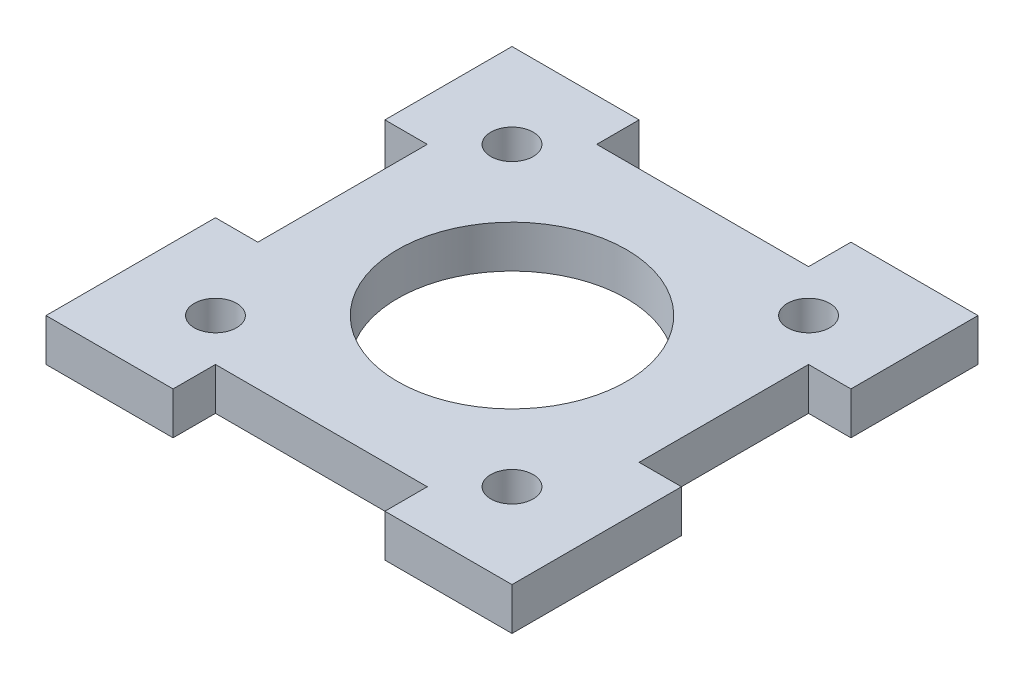
ISO-10303-21;
HEADER;
FILE_DESCRIPTION(('STEP AP214'),'2;1');
FILE_NAME('part.step','',(''),(''),'','','');
FILE_SCHEMA(('AUTOMOTIVE_DESIGN { 1 0 10303 214 1 1 1 1 }'));
ENDSEC;
DATA;
#1=APPLICATION_CONTEXT('core data for automotive mechanical design processes');
#2=APPLICATION_PROTOCOL_DEFINITION('international standard','automotive_design',2000,#1);
#3=PRODUCT_CONTEXT('',#1,'mechanical');
#4=PRODUCT('Part','Part','',(#3));
#5=PRODUCT_RELATED_PRODUCT_CATEGORY('part','',(#4));
#6=PRODUCT_DEFINITION_FORMATION('','',#4);
#7=PRODUCT_DEFINITION_CONTEXT('part definition',#1,'design');
#8=PRODUCT_DEFINITION('design','',#6,#7);
#9=PRODUCT_DEFINITION_SHAPE('','',#8);
#10=(LENGTH_UNIT() NAMED_UNIT(*) SI_UNIT(.MILLI.,.METRE.));
#11=(NAMED_UNIT(*) PLANE_ANGLE_UNIT() SI_UNIT($,.RADIAN.));
#12=(NAMED_UNIT(*) SI_UNIT($,.STERADIAN.) SOLID_ANGLE_UNIT());
#13=UNCERTAINTY_MEASURE_WITH_UNIT(LENGTH_MEASURE(1.E-05),#10,'distance_accuracy_value','');
#14=(GEOMETRIC_REPRESENTATION_CONTEXT(3) GLOBAL_UNCERTAINTY_ASSIGNED_CONTEXT((#13)) GLOBAL_UNIT_ASSIGNED_CONTEXT((#10,
#11,#12)) REPRESENTATION_CONTEXT('',''));
#15=CARTESIAN_POINT('',(0.,0.,0.));
#16=DIRECTION('',(0.,0.,1.));
#17=DIRECTION('',(1.,0.,0.));
#18=AXIS2_PLACEMENT_3D('',#15,#16,#17);
#19=CARTESIAN_POINT('',(0.,5.,0.));
#20=DIRECTION('',(0.,-1.,0.));
#21=DIRECTION('',(0.,0.,-1.));
#22=AXIS2_PLACEMENT_3D('',#19,#20,#21);
#23=PLANE('',#22);
#24=DIRECTION('',(1.,0.,0.));
#25=VECTOR('',#24,1.);
#26=CARTESIAN_POINT('',(12.5,5.,27.5));
#27=LINE('',#26,#25);
#28=CARTESIAN_POINT('',(12.5,5.,27.5));
#29=VERTEX_POINT('',#28);
#30=CARTESIAN_POINT('',(27.5,5.,27.5));
#31=VERTEX_POINT('',#30);
#32=EDGE_CURVE('E241',#29,#31,#27,.T.);
#33=ORIENTED_EDGE('',*,*,#32,.T.);
#34=DIRECTION('',(0.,0.,-1.));
#35=VECTOR('',#34,1.);
#36=CARTESIAN_POINT('',(27.5,5.,7.5));
#37=LINE('',#36,#35);
#38=CARTESIAN_POINT('',(27.5,5.,7.5));
#39=VERTEX_POINT('',#38);
#40=EDGE_CURVE('E129',#31,#39,#37,.T.);
#41=ORIENTED_EDGE('',*,*,#40,.T.);
#42=DIRECTION('',(-1.,0.,0.));
#43=VECTOR('',#42,1.);
#44=CARTESIAN_POINT('',(27.5,5.,7.5));
#45=LINE('',#44,#43);
#46=CARTESIAN_POINT('',(22.5,5.,7.5));
#47=VERTEX_POINT('',#46);
#48=EDGE_CURVE('E292',#39,#47,#45,.T.);
#49=ORIENTED_EDGE('',*,*,#48,.T.);
#50=DIRECTION('',(0.,0.,-1.));
#51=VECTOR('',#50,1.);
#52=CARTESIAN_POINT('',(22.5,5.,7.5));
#53=LINE('',#52,#51);
#54=CARTESIAN_POINT('',(22.5,5.,-12.5));
#55=VERTEX_POINT('',#54);
#56=EDGE_CURVE('E311',#47,#55,#53,.T.);
#57=ORIENTED_EDGE('',*,*,#56,.T.);
#58=DIRECTION('',(1.,0.,0.));
#59=VECTOR('',#58,1.);
#60=CARTESIAN_POINT('',(27.5,5.,-12.5));
#61=LINE('',#60,#59);
#62=CARTESIAN_POINT('',(27.5,5.,-12.5));
#63=VERTEX_POINT('',#62);
#64=EDGE_CURVE('E308',#55,#63,#61,.T.);
#65=ORIENTED_EDGE('',*,*,#64,.T.);
#66=DIRECTION('',(0.,0.,-1.));
#67=VECTOR('',#66,1.);
#68=CARTESIAN_POINT('',(27.5,5.,-27.5));
#69=LINE('',#68,#67);
#70=CARTESIAN_POINT('',(27.5,5.,-27.5));
#71=VERTEX_POINT('',#70);
#72=EDGE_CURVE('E310',#63,#71,#69,.T.);
#73=ORIENTED_EDGE('',*,*,#72,.T.);
#74=DIRECTION('',(-1.,0.,0.));
#75=VECTOR('',#74,1.);
#76=CARTESIAN_POINT('',(12.5,5.,-27.5));
#77=LINE('',#76,#75);
#78=CARTESIAN_POINT('',(12.5,5.,-27.5));
#79=VERTEX_POINT('',#78);
#80=EDGE_CURVE('E313',#71,#79,#77,.T.);
#81=ORIENTED_EDGE('',*,*,#80,.T.);
#82=DIRECTION('',(0.,0.,1.));
#83=VECTOR('',#82,1.);
#84=CARTESIAN_POINT('',(12.5,5.,-27.5));
#85=LINE('',#84,#83);
#86=CARTESIAN_POINT('',(12.5,5.,-22.5));
#87=VERTEX_POINT('',#86);
#88=EDGE_CURVE('E319',#79,#87,#85,.T.);
#89=ORIENTED_EDGE('',*,*,#88,.T.);
#90=DIRECTION('',(-1.,0.,0.));
#91=VECTOR('',#90,1.);
#92=CARTESIAN_POINT('',(12.5,5.,-22.5));
#93=LINE('',#92,#91);
#94=CARTESIAN_POINT('',(-12.5,5.,-22.5));
#95=VERTEX_POINT('',#94);
#96=EDGE_CURVE('E321',#87,#95,#93,.T.);
#97=ORIENTED_EDGE('',*,*,#96,.T.);
#98=DIRECTION('',(0.,0.,-1.));
#99=VECTOR('',#98,1.);
#100=CARTESIAN_POINT('',(-12.5,5.,-27.5));
#101=LINE('',#100,#99);
#102=CARTESIAN_POINT('',(-12.5,5.,-27.5));
#103=VERTEX_POINT('',#102);
#104=EDGE_CURVE('E323',#95,#103,#101,.T.);
#105=ORIENTED_EDGE('',*,*,#104,.T.);
#106=DIRECTION('',(-1.,0.,0.));
#107=VECTOR('',#106,1.);
#108=CARTESIAN_POINT('',(-27.5,5.,-27.5));
#109=LINE('',#108,#107);
#110=CARTESIAN_POINT('',(-27.5,5.,-27.5));
#111=VERTEX_POINT('',#110);
#112=EDGE_CURVE('E325',#103,#111,#109,.T.);
#113=ORIENTED_EDGE('',*,*,#112,.T.);
#114=DIRECTION('',(0.,0.,1.));
#115=VECTOR('',#114,1.);
#116=CARTESIAN_POINT('',(-27.5,5.,-27.5));
#117=LINE('',#116,#115);
#118=CARTESIAN_POINT('',(-27.5,5.,-12.5));
#119=VERTEX_POINT('',#118);
#120=EDGE_CURVE('E327',#111,#119,#117,.T.);
#121=ORIENTED_EDGE('',*,*,#120,.T.);
#122=DIRECTION('',(1.,0.,0.));
#123=VECTOR('',#122,1.);
#124=CARTESIAN_POINT('',(-27.5,5.,-12.5));
#125=LINE('',#124,#123);
#126=CARTESIAN_POINT('',(-22.5,5.,-12.5));
#127=VERTEX_POINT('',#126);
#128=EDGE_CURVE('E329',#119,#127,#125,.T.);
#129=ORIENTED_EDGE('',*,*,#128,.T.);
#130=DIRECTION('',(0.,0.,1.));
#131=VECTOR('',#130,1.);
#132=CARTESIAN_POINT('',(-22.5,5.,7.50000000000001));
#133=LINE('',#132,#131);
#134=CARTESIAN_POINT('',(-22.5,5.,7.50000000000001));
#135=VERTEX_POINT('',#134);
#136=EDGE_CURVE('E331',#127,#135,#133,.T.);
#137=ORIENTED_EDGE('',*,*,#136,.T.);
#138=DIRECTION('',(-1.,0.,0.));
#139=VECTOR('',#138,1.);
#140=CARTESIAN_POINT('',(-27.5,5.,7.50000000000001));
#141=LINE('',#140,#139);
#142=CARTESIAN_POINT('',(-27.5,5.,7.50000000000001));
#143=VERTEX_POINT('',#142);
#144=EDGE_CURVE('E333',#135,#143,#141,.T.);
#145=ORIENTED_EDGE('',*,*,#144,.T.);
#146=DIRECTION('',(0.,0.,1.));
#147=VECTOR('',#146,1.);
#148=CARTESIAN_POINT('',(-27.5,5.,7.50000000000001));
#149=LINE('',#148,#147);
#150=CARTESIAN_POINT('',(-27.5,5.,27.5));
#151=VERTEX_POINT('',#150);
#152=EDGE_CURVE('E335',#143,#151,#149,.T.);
#153=ORIENTED_EDGE('',*,*,#152,.T.);
#154=DIRECTION('',(1.,0.,0.));
#155=VECTOR('',#154,1.);
#156=CARTESIAN_POINT('',(-27.5,5.,27.5));
#157=LINE('',#156,#155);
#158=CARTESIAN_POINT('',(-12.5,5.,27.5));
#159=VERTEX_POINT('',#158);
#160=EDGE_CURVE('E184',#151,#159,#157,.T.);
#161=ORIENTED_EDGE('',*,*,#160,.T.);
#162=DIRECTION('',(0.,0.,-1.));
#163=VECTOR('',#162,1.);
#164=CARTESIAN_POINT('',(-12.5,5.,27.5));
#165=LINE('',#164,#163);
#166=CARTESIAN_POINT('',(-12.5,5.,22.5));
#167=VERTEX_POINT('',#166);
#168=EDGE_CURVE('E178',#159,#167,#165,.T.);
#169=ORIENTED_EDGE('',*,*,#168,.T.);
#170=DIRECTION('',(1.,0.,0.));
#171=VECTOR('',#170,1.);
#172=CARTESIAN_POINT('',(12.5,5.,22.5));
#173=LINE('',#172,#171);
#174=CARTESIAN_POINT('',(12.5,5.,22.5));
#175=VERTEX_POINT('',#174);
#176=EDGE_CURVE('E182',#167,#175,#173,.T.);
#177=ORIENTED_EDGE('',*,*,#176,.T.);
#178=DIRECTION('',(0.,0.,1.));
#179=VECTOR('',#178,1.);
#180=CARTESIAN_POINT('',(12.5,5.,27.5));
#181=LINE('',#180,#179);
#182=EDGE_CURVE('E50',#175,#29,#181,.T.);
#183=ORIENTED_EDGE('',*,*,#182,.T.);
#184=EDGE_LOOP('',(#33,#41,#49,#57,#65,#73,#81,#89,#97,#105,#113,#121,#129,#137,#145,#153,#161,
#169,#177,#183));
#185=FACE_BOUND('',#184,.T.);
#186=CARTESIAN_POINT('',(17.5,5.,-17.5));
#187=DIRECTION('',(0.,1.,0.));
#188=DIRECTION('',(0.,0.,1.));
#189=AXIS2_PLACEMENT_3D('',#186,#187,#188);
#190=CIRCLE('',#189,2.5);
#191=CARTESIAN_POINT('',(17.5,5.,-15.));
#192=VERTEX_POINT('',#191);
#193=EDGE_CURVE('E206',#192,#192,#190,.T.);
#194=ORIENTED_EDGE('',*,*,#193,.F.);
#195=EDGE_LOOP('',(#194));
#196=FACE_BOUND('',#195,.T.);
#197=CARTESIAN_POINT('',(-17.5,5.,-17.5));
#198=DIRECTION('',(0.,1.,0.));
#199=DIRECTION('',(0.,0.,-1.));
#200=AXIS2_PLACEMENT_3D('',#197,#198,#199);
#201=CIRCLE('',#200,2.5);
#202=CARTESIAN_POINT('',(-17.5,5.,-20.));
#203=VERTEX_POINT('',#202);
#204=EDGE_CURVE('E409',#203,#203,#201,.T.);
#205=ORIENTED_EDGE('',*,*,#204,.F.);
#206=EDGE_LOOP('',(#205));
#207=FACE_BOUND('',#206,.T.);
#208=CARTESIAN_POINT('',(-17.5,5.,17.5));
#209=DIRECTION('',(0.,1.,0.));
#210=DIRECTION('',(0.,0.,1.));
#211=AXIS2_PLACEMENT_3D('',#208,#209,#210);
#212=CIRCLE('',#211,2.5);
#213=CARTESIAN_POINT('',(-17.5,5.,20.));
#214=VERTEX_POINT('',#213);
#215=EDGE_CURVE('E403',#214,#214,#212,.T.);
#216=ORIENTED_EDGE('',*,*,#215,.F.);
#217=EDGE_LOOP('',(#216));
#218=FACE_BOUND('',#217,.T.);
#219=CARTESIAN_POINT('',(17.5,5.,17.5));
#220=DIRECTION('',(0.,1.,0.));
#221=DIRECTION('',(0.,0.,-1.));
#222=AXIS2_PLACEMENT_3D('',#219,#220,#221);
#223=CIRCLE('',#222,2.5);
#224=CARTESIAN_POINT('',(17.5,5.,15.));
#225=VERTEX_POINT('',#224);
#226=EDGE_CURVE('E397',#225,#225,#223,.T.);
#227=ORIENTED_EDGE('',*,*,#226,.F.);
#228=EDGE_LOOP('',(#227));
#229=FACE_BOUND('',#228,.T.);
#230=CARTESIAN_POINT('',(0.,5.,0.));
#231=DIRECTION('',(0.,1.,0.));
#232=DIRECTION('',(0.,0.,1.));
#233=AXIS2_PLACEMENT_3D('',#230,#231,#232);
#234=CIRCLE('',#233,13.5);
#235=CARTESIAN_POINT('',(0.,5.,13.5));
#236=VERTEX_POINT('',#235);
#237=EDGE_CURVE('E388',#236,#236,#234,.T.);
#238=ORIENTED_EDGE('',*,*,#237,.F.);
#239=EDGE_LOOP('',(#238));
#240=FACE_BOUND('',#239,.T.);
#241=ADVANCED_FACE('F33',(#185,#196,#207,#218,#229,#240),#23,.F.);
#242=CARTESIAN_POINT('',(0.,0.,0.));
#243=DIRECTION('',(0.,-1.,0.));
#244=DIRECTION('',(0.,0.,-1.));
#245=AXIS2_PLACEMENT_3D('',#242,#243,#244);
#246=PLANE('',#245);
#247=CARTESIAN_POINT('',(17.5,0.,17.5));
#248=DIRECTION('',(0.,1.,0.));
#249=DIRECTION('',(0.,0.,-1.));
#250=AXIS2_PLACEMENT_3D('',#247,#248,#249);
#251=CIRCLE('',#250,2.5);
#252=CARTESIAN_POINT('',(17.5,0.,15.));
#253=VERTEX_POINT('',#252);
#254=EDGE_CURVE('E394',#253,#253,#251,.T.);
#255=ORIENTED_EDGE('',*,*,#254,.T.);
#256=EDGE_LOOP('',(#255));
#257=FACE_BOUND('',#256,.T.);
#258=CARTESIAN_POINT('',(-17.5,0.,-17.5));
#259=DIRECTION('',(0.,1.,0.));
#260=DIRECTION('',(0.,0.,-1.));
#261=AXIS2_PLACEMENT_3D('',#258,#259,#260);
#262=CIRCLE('',#261,2.5);
#263=CARTESIAN_POINT('',(-17.5,0.,-20.));
#264=VERTEX_POINT('',#263);
#265=EDGE_CURVE('E406',#264,#264,#262,.T.);
#266=ORIENTED_EDGE('',*,*,#265,.T.);
#267=EDGE_LOOP('',(#266));
#268=FACE_BOUND('',#267,.T.);
#269=DIRECTION('',(1.,0.,0.));
#270=VECTOR('',#269,1.);
#271=CARTESIAN_POINT('',(12.5,0.,27.5));
#272=LINE('',#271,#270);
#273=CARTESIAN_POINT('',(12.5,0.,27.5));
#274=VERTEX_POINT('',#273);
#275=CARTESIAN_POINT('',(27.5,0.,27.5));
#276=VERTEX_POINT('',#275);
#277=EDGE_CURVE('E202',#274,#276,#272,.T.);
#278=ORIENTED_EDGE('',*,*,#277,.F.);
#279=DIRECTION('',(0.,0.,1.));
#280=VECTOR('',#279,1.);
#281=CARTESIAN_POINT('',(12.5,0.,27.5));
#282=LINE('',#281,#280);
#283=CARTESIAN_POINT('',(12.5,0.,22.5));
#284=VERTEX_POINT('',#283);
#285=EDGE_CURVE('E121',#284,#274,#282,.T.);
#286=ORIENTED_EDGE('',*,*,#285,.F.);
#287=DIRECTION('',(1.,0.,0.));
#288=VECTOR('',#287,1.);
#289=CARTESIAN_POINT('',(12.5,0.,22.5));
#290=LINE('',#289,#288);
#291=CARTESIAN_POINT('',(-12.5,0.,22.5));
#292=VERTEX_POINT('',#291);
#293=EDGE_CURVE('E115',#292,#284,#290,.T.);
#294=ORIENTED_EDGE('',*,*,#293,.F.);
#295=DIRECTION('',(0.,0.,-1.));
#296=VECTOR('',#295,1.);
#297=CARTESIAN_POINT('',(-12.5,0.,27.5));
#298=LINE('',#297,#296);
#299=CARTESIAN_POINT('',(-12.5,0.,27.5));
#300=VERTEX_POINT('',#299);
#301=EDGE_CURVE('E192',#300,#292,#298,.T.);
#302=ORIENTED_EDGE('',*,*,#301,.F.);
#303=DIRECTION('',(1.,0.,0.));
#304=VECTOR('',#303,1.);
#305=CARTESIAN_POINT('',(-27.5,0.,27.5));
#306=LINE('',#305,#304);
#307=CARTESIAN_POINT('',(-27.5,0.,27.5));
#308=VERTEX_POINT('',#307);
#309=EDGE_CURVE('E236',#308,#300,#306,.T.);
#310=ORIENTED_EDGE('',*,*,#309,.F.);
#311=DIRECTION('',(0.,0.,1.));
#312=VECTOR('',#311,1.);
#313=CARTESIAN_POINT('',(-27.5,0.,7.50000000000001));
#314=LINE('',#313,#312);
#315=CARTESIAN_POINT('',(-27.5,0.,7.50000000000001));
#316=VERTEX_POINT('',#315);
#317=EDGE_CURVE('E234',#316,#308,#314,.T.);
#318=ORIENTED_EDGE('',*,*,#317,.F.);
#319=DIRECTION('',(-1.,0.,0.));
#320=VECTOR('',#319,1.);
#321=CARTESIAN_POINT('',(-27.5,0.,7.50000000000001));
#322=LINE('',#321,#320);
#323=CARTESIAN_POINT('',(-22.5,0.,7.50000000000001));
#324=VERTEX_POINT('',#323);
#325=EDGE_CURVE('E232',#324,#316,#322,.T.);
#326=ORIENTED_EDGE('',*,*,#325,.F.);
#327=DIRECTION('',(0.,0.,1.));
#328=VECTOR('',#327,1.);
#329=CARTESIAN_POINT('',(-22.5,0.,7.50000000000001));
#330=LINE('',#329,#328);
#331=CARTESIAN_POINT('',(-22.5,0.,-12.5));
#332=VERTEX_POINT('',#331);
#333=EDGE_CURVE('E230',#332,#324,#330,.T.);
#334=ORIENTED_EDGE('',*,*,#333,.F.);
#335=DIRECTION('',(1.,0.,0.));
#336=VECTOR('',#335,1.);
#337=CARTESIAN_POINT('',(-27.5,0.,-12.5));
#338=LINE('',#337,#336);
#339=CARTESIAN_POINT('',(-27.5,0.,-12.5));
#340=VERTEX_POINT('',#339);
#341=EDGE_CURVE('E228',#340,#332,#338,.T.);
#342=ORIENTED_EDGE('',*,*,#341,.F.);
#343=DIRECTION('',(0.,0.,1.));
#344=VECTOR('',#343,1.);
#345=CARTESIAN_POINT('',(-27.5,0.,-27.5));
#346=LINE('',#345,#344);
#347=CARTESIAN_POINT('',(-27.5,0.,-27.5));
#348=VERTEX_POINT('',#347);
#349=EDGE_CURVE('E226',#348,#340,#346,.T.);
#350=ORIENTED_EDGE('',*,*,#349,.F.);
#351=DIRECTION('',(-1.,0.,0.));
#352=VECTOR('',#351,1.);
#353=CARTESIAN_POINT('',(-27.5,0.,-27.5));
#354=LINE('',#353,#352);
#355=CARTESIAN_POINT('',(-12.5,0.,-27.5));
#356=VERTEX_POINT('',#355);
#357=EDGE_CURVE('E224',#356,#348,#354,.T.);
#358=ORIENTED_EDGE('',*,*,#357,.F.);
#359=DIRECTION('',(0.,0.,-1.));
#360=VECTOR('',#359,1.);
#361=CARTESIAN_POINT('',(-12.5,0.,-27.5));
#362=LINE('',#361,#360);
#363=CARTESIAN_POINT('',(-12.5,0.,-22.5));
#364=VERTEX_POINT('',#363);
#365=EDGE_CURVE('E222',#364,#356,#362,.T.);
#366=ORIENTED_EDGE('',*,*,#365,.F.);
#367=DIRECTION('',(-1.,0.,0.));
#368=VECTOR('',#367,1.);
#369=CARTESIAN_POINT('',(12.5,0.,-22.5));
#370=LINE('',#369,#368);
#371=CARTESIAN_POINT('',(12.5,0.,-22.5));
#372=VERTEX_POINT('',#371);
#373=EDGE_CURVE('E220',#372,#364,#370,.T.);
#374=ORIENTED_EDGE('',*,*,#373,.F.);
#375=DIRECTION('',(0.,0.,1.));
#376=VECTOR('',#375,1.);
#377=CARTESIAN_POINT('',(12.5,0.,-27.5));
#378=LINE('',#377,#376);
#379=CARTESIAN_POINT('',(12.5,0.,-27.5));
#380=VERTEX_POINT('',#379);
#381=EDGE_CURVE('E218',#380,#372,#378,.T.);
#382=ORIENTED_EDGE('',*,*,#381,.F.);
#383=DIRECTION('',(-1.,0.,0.));
#384=VECTOR('',#383,1.);
#385=CARTESIAN_POINT('',(12.5,0.,-27.5));
#386=LINE('',#385,#384);
#387=CARTESIAN_POINT('',(27.5,0.,-27.5));
#388=VERTEX_POINT('',#387);
#389=EDGE_CURVE('E216',#388,#380,#386,.T.);
#390=ORIENTED_EDGE('',*,*,#389,.F.);
#391=DIRECTION('',(0.,0.,-1.));
#392=VECTOR('',#391,1.);
#393=CARTESIAN_POINT('',(27.5,0.,-27.5));
#394=LINE('',#393,#392);
#395=CARTESIAN_POINT('',(27.5,0.,-12.5));
#396=VERTEX_POINT('',#395);
#397=EDGE_CURVE('E214',#396,#388,#394,.T.);
#398=ORIENTED_EDGE('',*,*,#397,.F.);
#399=DIRECTION('',(1.,0.,0.));
#400=VECTOR('',#399,1.);
#401=CARTESIAN_POINT('',(27.5,0.,-12.5));
#402=LINE('',#401,#400);
#403=CARTESIAN_POINT('',(22.5,0.,-12.5));
#404=VERTEX_POINT('',#403);
#405=EDGE_CURVE('E212',#404,#396,#402,.T.);
#406=ORIENTED_EDGE('',*,*,#405,.F.);
#407=DIRECTION('',(0.,0.,-1.));
#408=VECTOR('',#407,1.);
#409=CARTESIAN_POINT('',(22.5,0.,7.5));
#410=LINE('',#409,#408);
#411=CARTESIAN_POINT('',(22.5,0.,7.5));
#412=VERTEX_POINT('',#411);
#413=EDGE_CURVE('E210',#412,#404,#410,.T.);
#414=ORIENTED_EDGE('',*,*,#413,.F.);
#415=DIRECTION('',(-1.,0.,0.));
#416=VECTOR('',#415,1.);
#417=CARTESIAN_POINT('',(27.5,0.,7.5));
#418=LINE('',#417,#416);
#419=CARTESIAN_POINT('',(27.5,0.,7.5));
#420=VERTEX_POINT('',#419);
#421=EDGE_CURVE('E208',#420,#412,#418,.T.);
#422=ORIENTED_EDGE('',*,*,#421,.F.);
#423=DIRECTION('',(0.,0.,-1.));
#424=VECTOR('',#423,1.);
#425=CARTESIAN_POINT('',(27.5,0.,7.5));
#426=LINE('',#425,#424);
#427=EDGE_CURVE('E205',#276,#420,#426,.T.);
#428=ORIENTED_EDGE('',*,*,#427,.F.);
#429=EDGE_LOOP('',(#278,#286,#294,#302,#310,#318,#326,#334,#342,#350,#358,#366,#374,#382,#390,
#398,#406,#414,#422,#428));
#430=FACE_BOUND('',#429,.T.);
#431=CARTESIAN_POINT('',(17.5,0.,-17.5));
#432=DIRECTION('',(0.,1.,0.));
#433=DIRECTION('',(0.,0.,1.));
#434=AXIS2_PLACEMENT_3D('',#431,#432,#433);
#435=CIRCLE('',#434,2.5);
#436=CARTESIAN_POINT('',(17.5,0.,-15.));
#437=VERTEX_POINT('',#436);
#438=EDGE_CURVE('E412',#437,#437,#435,.T.);
#439=ORIENTED_EDGE('',*,*,#438,.T.);
#440=EDGE_LOOP('',(#439));
#441=FACE_BOUND('',#440,.T.);
#442=CARTESIAN_POINT('',(-17.5,0.,17.5));
#443=DIRECTION('',(0.,1.,0.));
#444=DIRECTION('',(0.,0.,1.));
#445=AXIS2_PLACEMENT_3D('',#442,#443,#444);
#446=CIRCLE('',#445,2.5);
#447=CARTESIAN_POINT('',(-17.5,0.,20.));
#448=VERTEX_POINT('',#447);
#449=EDGE_CURVE('E400',#448,#448,#446,.T.);
#450=ORIENTED_EDGE('',*,*,#449,.T.);
#451=EDGE_LOOP('',(#450));
#452=FACE_BOUND('',#451,.T.);
#453=CARTESIAN_POINT('',(0.,0.,0.));
#454=DIRECTION('',(0.,1.,0.));
#455=DIRECTION('',(0.,0.,1.));
#456=AXIS2_PLACEMENT_3D('',#453,#454,#455);
#457=CIRCLE('',#456,13.5);
#458=CARTESIAN_POINT('',(0.,0.,13.5));
#459=VERTEX_POINT('',#458);
#460=EDGE_CURVE('E391',#459,#459,#457,.T.);
#461=ORIENTED_EDGE('',*,*,#460,.T.);
#462=EDGE_LOOP('',(#461));
#463=FACE_BOUND('',#462,.T.);
#464=ADVANCED_FACE('F296',(#257,#268,#430,#441,#452,#463),#246,.T.);
#465=CARTESIAN_POINT('',(12.5,5.,27.5));
#466=DIRECTION('',(0.,0.,-1.));
#467=DIRECTION('',(-1.,0.,0.));
#468=AXIS2_PLACEMENT_3D('',#465,#466,#467);
#469=PLANE('',#468);
#470=ORIENTED_EDGE('',*,*,#277,.T.);
#471=DIRECTION('',(0.,-1.,0.));
#472=VECTOR('',#471,1.);
#473=CARTESIAN_POINT('',(27.5,5.,27.5));
#474=LINE('',#473,#472);
#475=EDGE_CURVE('E11',#31,#276,#474,.T.);
#476=ORIENTED_EDGE('',*,*,#475,.F.);
#477=ORIENTED_EDGE('',*,*,#32,.F.);
#478=DIRECTION('',(0.,-1.,0.));
#479=VECTOR('',#478,1.);
#480=CARTESIAN_POINT('',(12.5,5.,27.5));
#481=LINE('',#480,#479);
#482=EDGE_CURVE('E198',#29,#274,#481,.T.);
#483=ORIENTED_EDGE('',*,*,#482,.T.);
#484=EDGE_LOOP('',(#470,#476,#477,#483));
#485=FACE_BOUND('',#484,.T.);
#486=ADVANCED_FACE('F35',(#485),#469,.F.);
#487=CARTESIAN_POINT('',(27.5,5.,7.5));
#488=DIRECTION('',(-1.,0.,0.));
#489=DIRECTION('',(0.,0.,1.));
#490=AXIS2_PLACEMENT_3D('',#487,#488,#489);
#491=PLANE('',#490);
#492=ORIENTED_EDGE('',*,*,#427,.T.);
#493=DIRECTION('',(0.,-1.,0.));
#494=VECTOR('',#493,1.);
#495=CARTESIAN_POINT('',(27.5,5.,7.5));
#496=LINE('',#495,#494);
#497=EDGE_CURVE('E42',#39,#420,#496,.T.);
#498=ORIENTED_EDGE('',*,*,#497,.F.);
#499=ORIENTED_EDGE('',*,*,#40,.F.);
#500=ORIENTED_EDGE('',*,*,#475,.T.);
#501=EDGE_LOOP('',(#492,#498,#499,#500));
#502=FACE_BOUND('',#501,.T.);
#503=ADVANCED_FACE('F613',(#502),#491,.F.);
#504=CARTESIAN_POINT('',(27.5,5.,7.5));
#505=DIRECTION('',(0.,0.,1.));
#506=DIRECTION('',(1.,0.,0.));
#507=AXIS2_PLACEMENT_3D('',#504,#505,#506);
#508=PLANE('',#507);
#509=ORIENTED_EDGE('',*,*,#421,.T.);
#510=DIRECTION('',(0.,-1.,0.));
#511=VECTOR('',#510,1.);
#512=CARTESIAN_POINT('',(22.5,5.,7.5));
#513=LINE('',#512,#511);
#514=EDGE_CURVE('E284',#47,#412,#513,.T.);
#515=ORIENTED_EDGE('',*,*,#514,.F.);
#516=ORIENTED_EDGE('',*,*,#48,.F.);
#517=ORIENTED_EDGE('',*,*,#497,.T.);
#518=EDGE_LOOP('',(#509,#515,#516,#517));
#519=FACE_BOUND('',#518,.T.);
#520=ADVANCED_FACE('F290',(#519),#508,.F.);
#521=CARTESIAN_POINT('',(22.5,5.,7.5));
#522=DIRECTION('',(-1.,0.,0.));
#523=DIRECTION('',(0.,0.,1.));
#524=AXIS2_PLACEMENT_3D('',#521,#522,#523);
#525=PLANE('',#524);
#526=ORIENTED_EDGE('',*,*,#413,.T.);
#527=DIRECTION('',(0.,-1.,0.));
#528=VECTOR('',#527,1.);
#529=CARTESIAN_POINT('',(22.5,5.,-12.5));
#530=LINE('',#529,#528);
#531=EDGE_CURVE('E281',#55,#404,#530,.T.);
#532=ORIENTED_EDGE('',*,*,#531,.F.);
#533=ORIENTED_EDGE('',*,*,#56,.F.);
#534=ORIENTED_EDGE('',*,*,#514,.T.);
#535=EDGE_LOOP('',(#526,#532,#533,#534));
#536=FACE_BOUND('',#535,.T.);
#537=ADVANCED_FACE('F302',(#536),#525,.F.);
#538=CARTESIAN_POINT('',(27.5,5.,-12.5));
#539=DIRECTION('',(0.,0.,-1.));
#540=DIRECTION('',(-1.,0.,0.));
#541=AXIS2_PLACEMENT_3D('',#538,#539,#540);
#542=PLANE('',#541);
#543=ORIENTED_EDGE('',*,*,#405,.T.);
#544=DIRECTION('',(0.,-1.,0.));
#545=VECTOR('',#544,1.);
#546=CARTESIAN_POINT('',(27.5,5.,-12.5));
#547=LINE('',#546,#545);
#548=EDGE_CURVE('E278',#63,#396,#547,.T.);
#549=ORIENTED_EDGE('',*,*,#548,.F.);
#550=ORIENTED_EDGE('',*,*,#64,.F.);
#551=ORIENTED_EDGE('',*,*,#531,.T.);
#552=EDGE_LOOP('',(#543,#549,#550,#551));
#553=FACE_BOUND('',#552,.T.);
#554=ADVANCED_FACE('F306',(#553),#542,.F.);
#555=CARTESIAN_POINT('',(27.5,5.,-27.5));
#556=DIRECTION('',(-1.,0.,0.));
#557=DIRECTION('',(0.,0.,1.));
#558=AXIS2_PLACEMENT_3D('',#555,#556,#557);
#559=PLANE('',#558);
#560=ORIENTED_EDGE('',*,*,#397,.T.);
#561=DIRECTION('',(0.,-1.,0.));
#562=VECTOR('',#561,1.);
#563=CARTESIAN_POINT('',(27.5,5.,-27.5));
#564=LINE('',#563,#562);
#565=EDGE_CURVE('E275',#71,#388,#564,.T.);
#566=ORIENTED_EDGE('',*,*,#565,.F.);
#567=ORIENTED_EDGE('',*,*,#72,.F.);
#568=ORIENTED_EDGE('',*,*,#548,.T.);
#569=EDGE_LOOP('',(#560,#566,#567,#568));
#570=FACE_BOUND('',#569,.T.);
#571=ADVANCED_FACE('F578',(#570),#559,.F.);
#572=CARTESIAN_POINT('',(12.5,5.,-27.5));
#573=DIRECTION('',(0.,0.,1.));
#574=DIRECTION('',(1.,0.,0.));
#575=AXIS2_PLACEMENT_3D('',#572,#573,#574);
#576=PLANE('',#575);
#577=ORIENTED_EDGE('',*,*,#389,.T.);
#578=DIRECTION('',(0.,-1.,0.));
#579=VECTOR('',#578,1.);
#580=CARTESIAN_POINT('',(12.5,5.,-27.5));
#581=LINE('',#580,#579);
#582=EDGE_CURVE('E272',#79,#380,#581,.T.);
#583=ORIENTED_EDGE('',*,*,#582,.F.);
#584=ORIENTED_EDGE('',*,*,#80,.F.);
#585=ORIENTED_EDGE('',*,*,#565,.T.);
#586=EDGE_LOOP('',(#577,#583,#584,#585));
#587=FACE_BOUND('',#586,.T.);
#588=ADVANCED_FACE('F568',(#587),#576,.F.);
#589=CARTESIAN_POINT('',(12.5,5.,-27.5));
#590=DIRECTION('',(1.,0.,0.));
#591=DIRECTION('',(0.,0.,-1.));
#592=AXIS2_PLACEMENT_3D('',#589,#590,#591);
#593=PLANE('',#592);
#594=ORIENTED_EDGE('',*,*,#381,.T.);
#595=DIRECTION('',(0.,-1.,0.));
#596=VECTOR('',#595,1.);
#597=CARTESIAN_POINT('',(12.5,5.,-22.5));
#598=LINE('',#597,#596);
#599=EDGE_CURVE('E269',#87,#372,#598,.T.);
#600=ORIENTED_EDGE('',*,*,#599,.F.);
#601=ORIENTED_EDGE('',*,*,#88,.F.);
#602=ORIENTED_EDGE('',*,*,#582,.T.);
#603=EDGE_LOOP('',(#594,#600,#601,#602));
#604=FACE_BOUND('',#603,.T.);
#605=ADVANCED_FACE('F558',(#604),#593,.F.);
#606=CARTESIAN_POINT('',(12.5,5.,-22.5));
#607=DIRECTION('',(0.,0.,1.));
#608=DIRECTION('',(1.,0.,0.));
#609=AXIS2_PLACEMENT_3D('',#606,#607,#608);
#610=PLANE('',#609);
#611=ORIENTED_EDGE('',*,*,#373,.T.);
#612=DIRECTION('',(0.,-1.,0.));
#613=VECTOR('',#612,1.);
#614=CARTESIAN_POINT('',(-12.5,5.,-22.5));
#615=LINE('',#614,#613);
#616=EDGE_CURVE('E266',#95,#364,#615,.T.);
#617=ORIENTED_EDGE('',*,*,#616,.F.);
#618=ORIENTED_EDGE('',*,*,#96,.F.);
#619=ORIENTED_EDGE('',*,*,#599,.T.);
#620=EDGE_LOOP('',(#611,#617,#618,#619));
#621=FACE_BOUND('',#620,.T.);
#622=ADVANCED_FACE('F548',(#621),#610,.F.);
#623=CARTESIAN_POINT('',(-12.5,5.,-27.5));
#624=DIRECTION('',(-1.,0.,0.));
#625=DIRECTION('',(0.,0.,1.));
#626=AXIS2_PLACEMENT_3D('',#623,#624,#625);
#627=PLANE('',#626);
#628=ORIENTED_EDGE('',*,*,#365,.T.);
#629=DIRECTION('',(0.,-1.,0.));
#630=VECTOR('',#629,1.);
#631=CARTESIAN_POINT('',(-12.5,5.,-27.5));
#632=LINE('',#631,#630);
#633=EDGE_CURVE('E263',#103,#356,#632,.T.);
#634=ORIENTED_EDGE('',*,*,#633,.F.);
#635=ORIENTED_EDGE('',*,*,#104,.F.);
#636=ORIENTED_EDGE('',*,*,#616,.T.);
#637=EDGE_LOOP('',(#628,#634,#635,#636));
#638=FACE_BOUND('',#637,.T.);
#639=ADVANCED_FACE('F538',(#638),#627,.F.);
#640=CARTESIAN_POINT('',(-27.5,5.,-27.5));
#641=DIRECTION('',(0.,0.,1.));
#642=DIRECTION('',(1.,0.,0.));
#643=AXIS2_PLACEMENT_3D('',#640,#641,#642);
#644=PLANE('',#643);
#645=ORIENTED_EDGE('',*,*,#357,.T.);
#646=DIRECTION('',(0.,-1.,0.));
#647=VECTOR('',#646,1.);
#648=CARTESIAN_POINT('',(-27.5,5.,-27.5));
#649=LINE('',#648,#647);
#650=EDGE_CURVE('E260',#111,#348,#649,.T.);
#651=ORIENTED_EDGE('',*,*,#650,.F.);
#652=ORIENTED_EDGE('',*,*,#112,.F.);
#653=ORIENTED_EDGE('',*,*,#633,.T.);
#654=EDGE_LOOP('',(#645,#651,#652,#653));
#655=FACE_BOUND('',#654,.T.);
#656=ADVANCED_FACE('F528',(#655),#644,.F.);
#657=CARTESIAN_POINT('',(-27.5,5.,-27.5));
#658=DIRECTION('',(1.,0.,0.));
#659=DIRECTION('',(0.,0.,-1.));
#660=AXIS2_PLACEMENT_3D('',#657,#658,#659);
#661=PLANE('',#660);
#662=ORIENTED_EDGE('',*,*,#349,.T.);
#663=DIRECTION('',(0.,-1.,0.));
#664=VECTOR('',#663,1.);
#665=CARTESIAN_POINT('',(-27.5,5.,-12.5));
#666=LINE('',#665,#664);
#667=EDGE_CURVE('E257',#119,#340,#666,.T.);
#668=ORIENTED_EDGE('',*,*,#667,.F.);
#669=ORIENTED_EDGE('',*,*,#120,.F.);
#670=ORIENTED_EDGE('',*,*,#650,.T.);
#671=EDGE_LOOP('',(#662,#668,#669,#670));
#672=FACE_BOUND('',#671,.T.);
#673=ADVANCED_FACE('F518',(#672),#661,.F.);
#674=CARTESIAN_POINT('',(-27.5,5.,-12.5));
#675=DIRECTION('',(0.,0.,-1.));
#676=DIRECTION('',(-1.,0.,0.));
#677=AXIS2_PLACEMENT_3D('',#674,#675,#676);
#678=PLANE('',#677);
#679=ORIENTED_EDGE('',*,*,#341,.T.);
#680=DIRECTION('',(0.,-1.,0.));
#681=VECTOR('',#680,1.);
#682=CARTESIAN_POINT('',(-22.5,5.,-12.5));
#683=LINE('',#682,#681);
#684=EDGE_CURVE('E254',#127,#332,#683,.T.);
#685=ORIENTED_EDGE('',*,*,#684,.F.);
#686=ORIENTED_EDGE('',*,*,#128,.F.);
#687=ORIENTED_EDGE('',*,*,#667,.T.);
#688=EDGE_LOOP('',(#679,#685,#686,#687));
#689=FACE_BOUND('',#688,.T.);
#690=ADVANCED_FACE('F508',(#689),#678,.F.);
#691=CARTESIAN_POINT('',(-22.5,5.,7.50000000000001));
#692=DIRECTION('',(1.,0.,0.));
#693=DIRECTION('',(0.,0.,-1.));
#694=AXIS2_PLACEMENT_3D('',#691,#692,#693);
#695=PLANE('',#694);
#696=ORIENTED_EDGE('',*,*,#333,.T.);
#697=DIRECTION('',(0.,-1.,0.));
#698=VECTOR('',#697,1.);
#699=CARTESIAN_POINT('',(-22.5,5.,7.50000000000001));
#700=LINE('',#699,#698);
#701=EDGE_CURVE('E251',#135,#324,#700,.T.);
#702=ORIENTED_EDGE('',*,*,#701,.F.);
#703=ORIENTED_EDGE('',*,*,#136,.F.);
#704=ORIENTED_EDGE('',*,*,#684,.T.);
#705=EDGE_LOOP('',(#696,#702,#703,#704));
#706=FACE_BOUND('',#705,.T.);
#707=ADVANCED_FACE('F498',(#706),#695,.F.);
#708=CARTESIAN_POINT('',(-27.5,5.,7.50000000000001));
#709=DIRECTION('',(0.,0.,1.));
#710=DIRECTION('',(1.,0.,0.));
#711=AXIS2_PLACEMENT_3D('',#708,#709,#710);
#712=PLANE('',#711);
#713=ORIENTED_EDGE('',*,*,#325,.T.);
#714=DIRECTION('',(0.,-1.,0.));
#715=VECTOR('',#714,1.);
#716=CARTESIAN_POINT('',(-27.5,5.,7.50000000000001));
#717=LINE('',#716,#715);
#718=EDGE_CURVE('E248',#143,#316,#717,.T.);
#719=ORIENTED_EDGE('',*,*,#718,.F.);
#720=ORIENTED_EDGE('',*,*,#144,.F.);
#721=ORIENTED_EDGE('',*,*,#701,.T.);
#722=EDGE_LOOP('',(#713,#719,#720,#721));
#723=FACE_BOUND('',#722,.T.);
#724=ADVANCED_FACE('F489',(#723),#712,.F.);
#725=CARTESIAN_POINT('',(-27.5,5.,7.50000000000001));
#726=DIRECTION('',(1.,0.,0.));
#727=DIRECTION('',(0.,0.,-1.));
#728=AXIS2_PLACEMENT_3D('',#725,#726,#727);
#729=PLANE('',#728);
#730=ORIENTED_EDGE('',*,*,#317,.T.);
#731=DIRECTION('',(0.,-1.,0.));
#732=VECTOR('',#731,1.);
#733=CARTESIAN_POINT('',(-27.5,5.,27.5));
#734=LINE('',#733,#732);
#735=EDGE_CURVE('E245',#151,#308,#734,.T.);
#736=ORIENTED_EDGE('',*,*,#735,.F.);
#737=ORIENTED_EDGE('',*,*,#152,.F.);
#738=ORIENTED_EDGE('',*,*,#718,.T.);
#739=EDGE_LOOP('',(#730,#736,#737,#738));
#740=FACE_BOUND('',#739,.T.);
#741=ADVANCED_FACE('F341',(#740),#729,.F.);
#742=CARTESIAN_POINT('',(-27.5,5.,27.5));
#743=DIRECTION('',(0.,0.,-1.));
#744=DIRECTION('',(-1.,0.,0.));
#745=AXIS2_PLACEMENT_3D('',#742,#743,#744);
#746=PLANE('',#745);
#747=ORIENTED_EDGE('',*,*,#309,.T.);
#748=DIRECTION('',(0.,-1.,0.));
#749=VECTOR('',#748,1.);
#750=CARTESIAN_POINT('',(-12.5,5.,27.5));
#751=LINE('',#750,#749);
#752=EDGE_CURVE('E193',#159,#300,#751,.T.);
#753=ORIENTED_EDGE('',*,*,#752,.F.);
#754=ORIENTED_EDGE('',*,*,#160,.F.);
#755=ORIENTED_EDGE('',*,*,#735,.T.);
#756=EDGE_LOOP('',(#747,#753,#754,#755));
#757=FACE_BOUND('',#756,.T.);
#758=ADVANCED_FACE('F345',(#757),#746,.F.);
#759=CARTESIAN_POINT('',(-12.5,5.,27.5));
#760=DIRECTION('',(-1.,0.,0.));
#761=DIRECTION('',(0.,0.,1.));
#762=AXIS2_PLACEMENT_3D('',#759,#760,#761);
#763=PLANE('',#762);
#764=ORIENTED_EDGE('',*,*,#301,.T.);
#765=DIRECTION('',(0.,-1.,0.));
#766=VECTOR('',#765,1.);
#767=CARTESIAN_POINT('',(-12.5,5.,22.5));
#768=LINE('',#767,#766);
#769=EDGE_CURVE('E189',#167,#292,#768,.T.);
#770=ORIENTED_EDGE('',*,*,#769,.F.);
#771=ORIENTED_EDGE('',*,*,#168,.F.);
#772=ORIENTED_EDGE('',*,*,#752,.T.);
#773=EDGE_LOOP('',(#764,#770,#771,#772));
#774=FACE_BOUND('',#773,.T.);
#775=ADVANCED_FACE('F190',(#774),#763,.F.);
#776=CARTESIAN_POINT('',(12.5,5.,22.5));
#777=DIRECTION('',(0.,0.,-1.));
#778=DIRECTION('',(-1.,0.,0.));
#779=AXIS2_PLACEMENT_3D('',#776,#777,#778);
#780=PLANE('',#779);
#781=ORIENTED_EDGE('',*,*,#293,.T.);
#782=DIRECTION('',(0.,-1.,0.));
#783=VECTOR('',#782,1.);
#784=CARTESIAN_POINT('',(12.5,5.,22.5));
#785=LINE('',#784,#783);
#786=EDGE_CURVE('E194',#175,#284,#785,.T.);
#787=ORIENTED_EDGE('',*,*,#786,.F.);
#788=ORIENTED_EDGE('',*,*,#176,.F.);
#789=ORIENTED_EDGE('',*,*,#769,.T.);
#790=EDGE_LOOP('',(#781,#787,#788,#789));
#791=FACE_BOUND('',#790,.T.);
#792=ADVANCED_FACE('F196',(#791),#780,.F.);
#793=CARTESIAN_POINT('',(12.5,5.,27.5));
#794=DIRECTION('',(1.,0.,0.));
#795=DIRECTION('',(0.,0.,-1.));
#796=AXIS2_PLACEMENT_3D('',#793,#794,#795);
#797=PLANE('',#796);
#798=ORIENTED_EDGE('',*,*,#285,.T.);
#799=ORIENTED_EDGE('',*,*,#482,.F.);
#800=ORIENTED_EDGE('',*,*,#182,.F.);
#801=ORIENTED_EDGE('',*,*,#786,.T.);
#802=EDGE_LOOP('',(#798,#799,#800,#801));
#803=FACE_BOUND('',#802,.T.);
#804=ADVANCED_FACE('F349',(#803),#797,.F.);
#805=CARTESIAN_POINT('',(17.5,5.,-17.5));
#806=DIRECTION('',(0.,-1.,0.));
#807=DIRECTION('',(0.,0.,-1.));
#808=AXIS2_PLACEMENT_3D('',#805,#806,#807);
#809=CYLINDRICAL_SURFACE('',#808,2.5);
#810=ORIENTED_EDGE('',*,*,#193,.T.);
#811=EDGE_LOOP('',(#810));
#812=FACE_BOUND('',#811,.T.);
#813=ORIENTED_EDGE('',*,*,#438,.F.);
#814=EDGE_LOOP('',(#813));
#815=FACE_BOUND('',#814,.T.);
#816=ADVANCED_FACE('F351',(#812,#815),#809,.F.);
#817=CARTESIAN_POINT('',(-17.5,5.,-17.5));
#818=DIRECTION('',(0.,-1.,0.));
#819=DIRECTION('',(0.,0.,-1.));
#820=AXIS2_PLACEMENT_3D('',#817,#818,#819);
#821=CYLINDRICAL_SURFACE('',#820,2.5);
#822=ORIENTED_EDGE('',*,*,#204,.T.);
#823=EDGE_LOOP('',(#822));
#824=FACE_BOUND('',#823,.T.);
#825=ORIENTED_EDGE('',*,*,#265,.F.);
#826=EDGE_LOOP('',(#825));
#827=FACE_BOUND('',#826,.T.);
#828=ADVANCED_FACE('F357',(#824,#827),#821,.F.);
#829=CARTESIAN_POINT('',(-17.5,5.,17.5));
#830=DIRECTION('',(0.,-1.,0.));
#831=DIRECTION('',(0.,0.,-1.));
#832=AXIS2_PLACEMENT_3D('',#829,#830,#831);
#833=CYLINDRICAL_SURFACE('',#832,2.5);
#834=ORIENTED_EDGE('',*,*,#215,.T.);
#835=EDGE_LOOP('',(#834));
#836=FACE_BOUND('',#835,.T.);
#837=ORIENTED_EDGE('',*,*,#449,.F.);
#838=EDGE_LOOP('',(#837));
#839=FACE_BOUND('',#838,.T.);
#840=ADVANCED_FACE('F371',(#836,#839),#833,.F.);
#841=CARTESIAN_POINT('',(17.5,5.,17.5));
#842=DIRECTION('',(0.,-1.,0.));
#843=DIRECTION('',(0.,0.,-1.));
#844=AXIS2_PLACEMENT_3D('',#841,#842,#843);
#845=CYLINDRICAL_SURFACE('',#844,2.5);
#846=ORIENTED_EDGE('',*,*,#226,.T.);
#847=EDGE_LOOP('',(#846));
#848=FACE_BOUND('',#847,.T.);
#849=ORIENTED_EDGE('',*,*,#254,.F.);
#850=EDGE_LOOP('',(#849));
#851=FACE_BOUND('',#850,.T.);
#852=ADVANCED_FACE('F375',(#848,#851),#845,.F.);
#853=CARTESIAN_POINT('',(0.,5.,0.));
#854=DIRECTION('',(0.,-1.,0.));
#855=DIRECTION('',(0.,0.,-1.));
#856=AXIS2_PLACEMENT_3D('',#853,#854,#855);
#857=CYLINDRICAL_SURFACE('',#856,13.5);
#858=ORIENTED_EDGE('',*,*,#237,.T.);
#859=EDGE_LOOP('',(#858));
#860=FACE_BOUND('',#859,.T.);
#861=ORIENTED_EDGE('',*,*,#460,.F.);
#862=EDGE_LOOP('',(#861));
#863=FACE_BOUND('',#862,.T.);
#864=ADVANCED_FACE('F379',(#860,#863),#857,.F.);
#865=CLOSED_SHELL('',(#241,#464,#486,#503,#520,#537,#554,#571,#588,#605,#622,#639,#656,#673,
#690,#707,#724,#741,#758,#775,#792,#804,#816,#828,#840,#852,#864));
#866=MANIFOLD_SOLID_BREP('B2',#865);
#867=ADVANCED_BREP_SHAPE_REPRESENTATION('',(#18,#866),#14);
#868=SHAPE_DEFINITION_REPRESENTATION(#9,#867);
ENDSEC;
END-ISO-10303-21;
